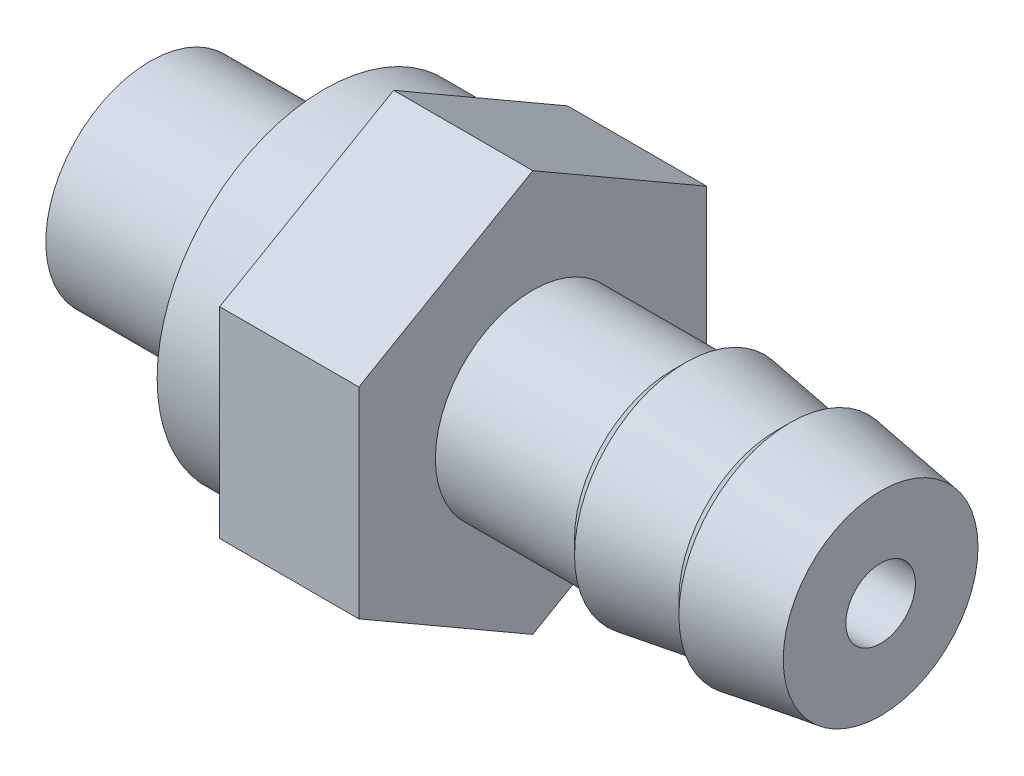
ISO-10303-21;
HEADER;
FILE_DESCRIPTION(('STEP AP214'),'2;1');
FILE_NAME('part.step','',(''),(''),'','','');
FILE_SCHEMA(('AUTOMOTIVE_DESIGN { 1 0 10303 214 1 1 1 1 }'));
ENDSEC;
DATA;
#1=APPLICATION_CONTEXT('core data for automotive mechanical design processes');
#2=APPLICATION_PROTOCOL_DEFINITION('international standard','automotive_design',2000,#1);
#3=PRODUCT_CONTEXT('',#1,'mechanical');
#4=PRODUCT('Part','Part','',(#3));
#5=PRODUCT_RELATED_PRODUCT_CATEGORY('part','',(#4));
#6=PRODUCT_DEFINITION_FORMATION('','',#4);
#7=PRODUCT_DEFINITION_CONTEXT('part definition',#1,'design');
#8=PRODUCT_DEFINITION('design','',#6,#7);
#9=PRODUCT_DEFINITION_SHAPE('','',#8);
#10=(LENGTH_UNIT() NAMED_UNIT(*) SI_UNIT(.MILLI.,.METRE.));
#11=(NAMED_UNIT(*) PLANE_ANGLE_UNIT() SI_UNIT($,.RADIAN.));
#12=(NAMED_UNIT(*) SI_UNIT($,.STERADIAN.) SOLID_ANGLE_UNIT());
#13=UNCERTAINTY_MEASURE_WITH_UNIT(LENGTH_MEASURE(1.E-05),#10,'distance_accuracy_value','');
#14=(GEOMETRIC_REPRESENTATION_CONTEXT(3) GLOBAL_UNCERTAINTY_ASSIGNED_CONTEXT((#13)) GLOBAL_UNIT_ASSIGNED_CONTEXT((#10,
#11,#12)) REPRESENTATION_CONTEXT('',''));
#15=CARTESIAN_POINT('',(0.,0.,0.));
#16=DIRECTION('',(0.,0.,1.));
#17=DIRECTION('',(1.,0.,0.));
#18=AXIS2_PLACEMENT_3D('',#15,#16,#17);
#19=CARTESIAN_POINT('',(5.50000000000003,2.88675134594087,0.));
#20=DIRECTION('',(-1.,0.,0.));
#21=DIRECTION('',(0.,-1.,0.));
#22=AXIS2_PLACEMENT_3D('',#19,#20,#21);
#23=PLANE('',#22);
#24=DIRECTION('',(0.,-0.500000000000001,-0.866025403784438));
#25=VECTOR('',#24,1.);
#26=CARTESIAN_POINT('',(5.50000000000003,-2.88675134594814,0.));
#27=LINE('',#26,#25);
#28=CARTESIAN_POINT('',(5.50000000000002,-2.88675134594814,0.));
#29=VERTEX_POINT('',#28);
#30=CARTESIAN_POINT('',(5.50000000000002,-1.44337567297407,2.49999999999999));
#31=VERTEX_POINT('',#30);
#32=EDGE_CURVE('E80',#29,#31,#27,.F.);
#33=ORIENTED_EDGE('',*,*,#32,.F.);
#34=DIRECTION('',(0.,0.499999999999999,-0.866025403784439));
#35=VECTOR('',#34,1.);
#36=CARTESIAN_POINT('',(5.49999999999999,-1.44337567297406,-2.50000000000002));
#37=LINE('',#36,#35);
#38=CARTESIAN_POINT('',(5.50000000000001,-1.44337567297406,-2.5));
#39=VERTEX_POINT('',#38);
#40=EDGE_CURVE('E71',#39,#29,#37,.F.);
#41=ORIENTED_EDGE('',*,*,#40,.F.);
#42=DIRECTION('',(0.,1.,0.));
#43=VECTOR('',#42,1.);
#44=CARTESIAN_POINT('',(5.49999999999999,1.44337567297406,-2.5));
#45=LINE('',#44,#43);
#46=CARTESIAN_POINT('',(5.50000000000002,1.44337567297406,-2.5));
#47=VERTEX_POINT('',#46);
#48=EDGE_CURVE('E66',#47,#39,#45,.F.);
#49=ORIENTED_EDGE('',*,*,#48,.F.);
#50=DIRECTION('',(0.,0.500000000000001,0.866025403784438));
#51=VECTOR('',#50,1.);
#52=CARTESIAN_POINT('',(5.50000000000003,2.88675134594814,0.));
#53=LINE('',#52,#51);
#54=CARTESIAN_POINT('',(5.50000000000003,2.88675134594905,1.5600529509057E-12));
#55=VERTEX_POINT('',#54);
#56=EDGE_CURVE('E140',#55,#47,#53,.F.);
#57=ORIENTED_EDGE('',*,*,#56,.F.);
#58=DIRECTION('',(0.,-0.499999999999999,0.866025403784439));
#59=VECTOR('',#58,1.);
#60=CARTESIAN_POINT('',(5.50000000000003,1.44337567297406,2.50000000000001));
#61=LINE('',#60,#59);
#62=CARTESIAN_POINT('',(5.50000000000002,1.44337567297589,2.49999999999999));
#63=VERTEX_POINT('',#62);
#64=EDGE_CURVE('E136',#63,#55,#61,.F.);
#65=ORIENTED_EDGE('',*,*,#64,.F.);
#66=DIRECTION('',(0.,-1.,0.));
#67=VECTOR('',#66,1.);
#68=CARTESIAN_POINT('',(5.5,-1.44337567297406,2.50000000000002));
#69=LINE('',#68,#67);
#70=EDGE_CURVE('E85',#31,#63,#69,.F.);
#71=ORIENTED_EDGE('',*,*,#70,.F.);
#72=EDGE_LOOP('',(#33,#41,#49,#57,#65,#71));
#73=FACE_BOUND('',#72,.T.);
#74=CARTESIAN_POINT('',(5.50000000000004,0.,0.));
#75=DIRECTION('',(-1.,0.,0.));
#76=DIRECTION('',(0.,-1.,0.));
#77=AXIS2_PLACEMENT_3D('',#74,#75,#76);
#78=CIRCLE('',#77,1.4);
#79=CARTESIAN_POINT('',(5.50000000000004,-1.4,0.));
#80=VERTEX_POINT('',#79);
#81=EDGE_CURVE('E19',#80,#80,#78,.F.);
#82=ORIENTED_EDGE('',*,*,#81,.F.);
#83=EDGE_LOOP('',(#82));
#84=FACE_BOUND('',#83,.T.);
#85=ADVANCED_FACE('F16',(#73,#84),#23,.F.);
#86=CARTESIAN_POINT('',(-4.74661546735969,-2.88675134594814,0.));
#87=DIRECTION('',(0.,-0.866025403784438,0.500000000000001));
#88=DIRECTION('',(0.,-0.500000000000001,-0.866025403784438));
#89=AXIS2_PLACEMENT_3D('',#86,#87,#88);
#90=PLANE('',#89);
#91=DIRECTION('',(1.,0.,0.));
#92=VECTOR('',#91,1.);
#93=CARTESIAN_POINT('',(-4.74661546735967,-1.44337567297406,2.50000000000002));
#94=LINE('',#93,#92);
#95=CARTESIAN_POINT('',(3.5,-1.44337567297408,2.49999999999999));
#96=VERTEX_POINT('',#95);
#97=EDGE_CURVE('E132',#96,#31,#94,.T.);
#98=ORIENTED_EDGE('',*,*,#97,.F.);
#99=DIRECTION('',(0.,-0.500000000000001,-0.866025403784438));
#100=VECTOR('',#99,1.);
#101=CARTESIAN_POINT('',(3.5,-1.44337567297406,2.50000000000001));
#102=LINE('',#101,#100);
#103=CARTESIAN_POINT('',(3.49999999999999,-2.88675134594814,0.));
#104=VERTEX_POINT('',#103);
#105=EDGE_CURVE('E92',#96,#104,#102,.T.);
#106=ORIENTED_EDGE('',*,*,#105,.T.);
#107=DIRECTION('',(1.,0.,0.));
#108=VECTOR('',#107,1.);
#109=CARTESIAN_POINT('',(-4.74661546735967,-2.88675134594813,0.));
#110=LINE('',#109,#108);
#111=EDGE_CURVE('E76',#29,#104,#110,.F.);
#112=ORIENTED_EDGE('',*,*,#111,.F.);
#113=ORIENTED_EDGE('',*,*,#32,.T.);
#114=EDGE_LOOP('',(#98,#106,#112,#113));
#115=FACE_BOUND('',#114,.T.);
#116=ADVANCED_FACE('F91',(#115),#90,.T.);
#117=CARTESIAN_POINT('',(-4.74661546735967,-1.44337567297406,-2.50000000000002));
#118=DIRECTION('',(0.,-0.866025403784439,-0.499999999999999));
#119=DIRECTION('',(0.,0.499999999999999,-0.866025403784439));
#120=AXIS2_PLACEMENT_3D('',#117,#118,#119);
#121=PLANE('',#120);
#122=ORIENTED_EDGE('',*,*,#111,.T.);
#123=DIRECTION('',(0.,0.500000000000003,-0.866025403784437));
#124=VECTOR('',#123,1.);
#125=CARTESIAN_POINT('',(3.5,-2.88675134594814,0.));
#126=LINE('',#125,#124);
#127=CARTESIAN_POINT('',(3.5,-1.44337567297406,-2.50000000000001));
#128=VERTEX_POINT('',#127);
#129=EDGE_CURVE('E150',#104,#128,#126,.T.);
#130=ORIENTED_EDGE('',*,*,#129,.T.);
#131=DIRECTION('',(1.,0.,0.));
#132=VECTOR('',#131,1.);
#133=CARTESIAN_POINT('',(-4.74661546735967,-1.44337567297406,-2.5));
#134=LINE('',#133,#132);
#135=EDGE_CURVE('E78',#39,#128,#134,.F.);
#136=ORIENTED_EDGE('',*,*,#135,.F.);
#137=ORIENTED_EDGE('',*,*,#40,.T.);
#138=EDGE_LOOP('',(#122,#130,#136,#137));
#139=FACE_BOUND('',#138,.T.);
#140=ADVANCED_FACE('F73',(#139),#121,.T.);
#141=CARTESIAN_POINT('',(-4.74661546735967,1.44337567297406,-2.5));
#142=DIRECTION('',(0.,0.,-1.));
#143=DIRECTION('',(0.,1.,0.));
#144=AXIS2_PLACEMENT_3D('',#141,#142,#143);
#145=PLANE('',#144);
#146=ORIENTED_EDGE('',*,*,#135,.T.);
#147=DIRECTION('',(0.,1.,0.));
#148=VECTOR('',#147,1.);
#149=CARTESIAN_POINT('',(3.5,2.39999999999418,-2.50000000000001));
#150=LINE('',#149,#148);
#151=CARTESIAN_POINT('',(3.5,1.44337567297406,-2.5));
#152=VERTEX_POINT('',#151);
#153=EDGE_CURVE('E144',#128,#152,#150,.T.);
#154=ORIENTED_EDGE('',*,*,#153,.T.);
#155=DIRECTION('',(1.,0.,0.));
#156=VECTOR('',#155,1.);
#157=CARTESIAN_POINT('',(-4.74661546735968,1.44337567297407,-2.50000000000001));
#158=LINE('',#157,#156);
#159=EDGE_CURVE('E138',#47,#152,#158,.F.);
#160=ORIENTED_EDGE('',*,*,#159,.F.);
#161=ORIENTED_EDGE('',*,*,#48,.T.);
#162=EDGE_LOOP('',(#146,#154,#160,#161));
#163=FACE_BOUND('',#162,.T.);
#164=ADVANCED_FACE('F143',(#163),#145,.T.);
#165=CARTESIAN_POINT('',(-4.74661546735968,2.88675134594814,0.));
#166=DIRECTION('',(0.,0.866025403784438,-0.500000000000001));
#167=DIRECTION('',(0.,0.500000000000001,0.866025403784438));
#168=AXIS2_PLACEMENT_3D('',#165,#166,#167);
#169=PLANE('',#168);
#170=ORIENTED_EDGE('',*,*,#159,.T.);
#171=DIRECTION('',(0.,0.499999999996226,0.866025403786617));
#172=VECTOR('',#171,1.);
#173=CARTESIAN_POINT('',(3.5,1.44337567297406,-2.5));
#174=LINE('',#173,#172);
#175=CARTESIAN_POINT('',(3.50000000000001,2.88675134594814,6.28327495437918E-12));
#176=VERTEX_POINT('',#175);
#177=EDGE_CURVE('E152',#152,#176,#174,.T.);
#178=ORIENTED_EDGE('',*,*,#177,.T.);
#179=DIRECTION('',(1.,0.,0.));
#180=VECTOR('',#179,1.);
#181=CARTESIAN_POINT('',(-4.74661546735967,2.88675134594814,0.));
#182=LINE('',#181,#180);
#183=EDGE_CURVE('E134',#55,#176,#182,.F.);
#184=ORIENTED_EDGE('',*,*,#183,.F.);
#185=ORIENTED_EDGE('',*,*,#56,.T.);
#186=EDGE_LOOP('',(#170,#178,#184,#185));
#187=FACE_BOUND('',#186,.T.);
#188=ADVANCED_FACE('F314',(#187),#169,.T.);
#189=CARTESIAN_POINT('',(-4.74661546735967,1.44337567297406,2.50000000000001));
#190=DIRECTION('',(0.,0.866025403784439,0.499999999999999));
#191=DIRECTION('',(0.,-0.499999999999999,0.866025403784439));
#192=AXIS2_PLACEMENT_3D('',#189,#190,#191);
#193=PLANE('',#192);
#194=ORIENTED_EDGE('',*,*,#183,.T.);
#195=DIRECTION('',(0.,-0.500000000000003,0.866025403784437));
#196=VECTOR('',#195,1.);
#197=CARTESIAN_POINT('',(3.5,2.88675134594087,1.25802146477838E-11));
#198=LINE('',#197,#196);
#199=CARTESIAN_POINT('',(3.50000000000001,1.44337567297588,2.5));
#200=VERTEX_POINT('',#199);
#201=EDGE_CURVE('E125',#176,#200,#198,.T.);
#202=ORIENTED_EDGE('',*,*,#201,.T.);
#203=DIRECTION('',(1.,0.,0.));
#204=VECTOR('',#203,1.);
#205=CARTESIAN_POINT('',(-4.74661546735967,1.44337567298133,2.50000000000002));
#206=LINE('',#205,#204);
#207=EDGE_CURVE('E34',#63,#200,#206,.F.);
#208=ORIENTED_EDGE('',*,*,#207,.F.);
#209=ORIENTED_EDGE('',*,*,#64,.T.);
#210=EDGE_LOOP('',(#194,#202,#208,#209));
#211=FACE_BOUND('',#210,.T.);
#212=ADVANCED_FACE('F306',(#211),#193,.T.);
#213=CARTESIAN_POINT('',(-4.74661546735967,-1.44337567297406,2.50000000000002));
#214=DIRECTION('',(0.,0.,1.));
#215=DIRECTION('',(0.,-1.,0.));
#216=AXIS2_PLACEMENT_3D('',#213,#214,#215);
#217=PLANE('',#216);
#218=ORIENTED_EDGE('',*,*,#207,.T.);
#219=DIRECTION('',(0.,1.,0.));
#220=VECTOR('',#219,1.);
#221=CARTESIAN_POINT('',(3.5,2.39999999999418,2.49999999999999));
#222=LINE('',#221,#220);
#223=EDGE_CURVE('E121',#200,#96,#222,.F.);
#224=ORIENTED_EDGE('',*,*,#223,.T.);
#225=ORIENTED_EDGE('',*,*,#97,.T.);
#226=ORIENTED_EDGE('',*,*,#70,.T.);
#227=EDGE_LOOP('',(#218,#224,#225,#226));
#228=FACE_BOUND('',#227,.T.);
#229=ADVANCED_FACE('F297',(#228),#217,.T.);
#230=CARTESIAN_POINT('',(0.,0.,0.));
#231=DIRECTION('',(-1.,0.,0.));
#232=DIRECTION('',(0.,-1.,0.));
#233=AXIS2_PLACEMENT_3D('',#230,#231,#232);
#234=CYLINDRICAL_SURFACE('',#233,1.4);
#235=ORIENTED_EDGE('',*,*,#81,.T.);
#236=EDGE_LOOP('',(#235));
#237=FACE_BOUND('',#236,.T.);
#238=CARTESIAN_POINT('',(7.49999999999318,0.,0.));
#239=DIRECTION('',(1.,0.,0.));
#240=DIRECTION('',(0.,0.,-1.));
#241=AXIS2_PLACEMENT_3D('',#238,#239,#240);
#242=CIRCLE('',#241,1.40000000004648);
#243=CARTESIAN_POINT('',(7.49999999999318,0.,-1.40000000004648));
#244=VERTEX_POINT('',#243);
#245=EDGE_CURVE('E115',#244,#244,#242,.T.);
#246=ORIENTED_EDGE('',*,*,#245,.F.);
#247=EDGE_LOOP('',(#246));
#248=FACE_BOUND('',#247,.T.);
#249=ADVANCED_FACE('F289',(#237,#248),#234,.T.);
#250=CARTESIAN_POINT('',(3.5,2.39999999999418,0.));
#251=DIRECTION('',(1.,0.,0.));
#252=DIRECTION('',(0.,1.,0.));
#253=AXIS2_PLACEMENT_3D('',#250,#251,#252);
#254=PLANE('',#253);
#255=ORIENTED_EDGE('',*,*,#201,.F.);
#256=ORIENTED_EDGE('',*,*,#177,.F.);
#257=ORIENTED_EDGE('',*,*,#153,.F.);
#258=ORIENTED_EDGE('',*,*,#129,.F.);
#259=ORIENTED_EDGE('',*,*,#105,.F.);
#260=ORIENTED_EDGE('',*,*,#223,.F.);
#261=EDGE_LOOP('',(#255,#256,#257,#258,#259,#260));
#262=FACE_BOUND('',#261,.T.);
#263=CARTESIAN_POINT('',(3.5,0.,0.));
#264=DIRECTION('',(-1.,0.,0.));
#265=DIRECTION('',(0.,-1.,0.));
#266=AXIS2_PLACEMENT_3D('',#263,#264,#265);
#267=CIRCLE('',#266,2.39999999999418);
#268=CARTESIAN_POINT('',(3.5,-2.39999999999418,0.));
#269=VERTEX_POINT('',#268);
#270=EDGE_CURVE('E113',#269,#269,#267,.T.);
#271=ORIENTED_EDGE('',*,*,#270,.F.);
#272=EDGE_LOOP('',(#271));
#273=FACE_BOUND('',#272,.T.);
#274=ADVANCED_FACE('F148',(#262,#273),#254,.F.);
#275=CARTESIAN_POINT('',(7.69999999994297,0.,0.));
#276=DIRECTION('',(1.,0.,0.));
#277=DIRECTION('',(0.,0.,-1.));
#278=AXIS2_PLACEMENT_3D('',#275,#276,#277);
#279=CONICAL_SURFACE('',#278,1.59999999999628,0.785398163397448);
#280=CARTESIAN_POINT('',(7.69999999999982,0.,0.));
#281=DIRECTION('',(-1.,0.,0.));
#282=DIRECTION('',(0.,0.,1.));
#283=AXIS2_PLACEMENT_3D('',#280,#281,#282);
#284=CIRCLE('',#283,1.6000000000105);
#285=CARTESIAN_POINT('',(7.69999999999982,0.,1.60000000001048));
#286=VERTEX_POINT('',#285);
#287=EDGE_CURVE('E112',#286,#286,#284,.F.);
#288=ORIENTED_EDGE('',*,*,#287,.F.);
#289=EDGE_LOOP('',(#288));
#290=FACE_BOUND('',#289,.T.);
#291=ORIENTED_EDGE('',*,*,#245,.T.);
#292=EDGE_LOOP('',(#291));
#293=FACE_BOUND('',#292,.T.);
#294=ADVANCED_FACE('F186',(#290,#293),#279,.T.);
#295=CARTESIAN_POINT('',(0.,0.,0.));
#296=DIRECTION('',(-1.,0.,0.));
#297=DIRECTION('',(0.,-1.,0.));
#298=AXIS2_PLACEMENT_3D('',#295,#296,#297);
#299=CYLINDRICAL_SURFACE('',#298,2.39999999999418);
#300=CARTESIAN_POINT('',(2.5,0.,0.));
#301=DIRECTION('',(-1.,0.,0.));
#302=DIRECTION('',(0.,-1.,0.));
#303=AXIS2_PLACEMENT_3D('',#300,#301,#302);
#304=CIRCLE('',#303,2.39999999999418);
#305=CARTESIAN_POINT('',(2.5,-2.39999999999418,0.));
#306=VERTEX_POINT('',#305);
#307=EDGE_CURVE('E110',#306,#306,#304,.F.);
#308=ORIENTED_EDGE('',*,*,#307,.T.);
#309=EDGE_LOOP('',(#308));
#310=FACE_BOUND('',#309,.T.);
#311=ORIENTED_EDGE('',*,*,#270,.T.);
#312=EDGE_LOOP('',(#311));
#313=FACE_BOUND('',#312,.T.);
#314=ADVANCED_FACE('F176',(#310,#313),#299,.T.);
#315=CARTESIAN_POINT('',(7.69999999994297,0.,0.));
#316=DIRECTION('',(-1.,0.,0.));
#317=DIRECTION('',(0.,0.,1.));
#318=AXIS2_PLACEMENT_3D('',#315,#316,#317);
#319=CONICAL_SURFACE('',#318,1.6000000000105,0.152649328394444);
#320=ORIENTED_EDGE('',*,*,#287,.T.);
#321=EDGE_LOOP('',(#320));
#322=FACE_BOUND('',#321,.T.);
#323=CARTESIAN_POINT('',(9.0000000000714,0.,0.));
#324=DIRECTION('',(1.,0.,0.));
#325=DIRECTION('',(0.,0.,-1.));
#326=AXIS2_PLACEMENT_3D('',#323,#324,#325);
#327=CIRCLE('',#326,1.39999999993279);
#328=CARTESIAN_POINT('',(9.0000000000714,0.,-1.39999999993279));
#329=VERTEX_POINT('',#328);
#330=EDGE_CURVE('E109',#329,#329,#327,.T.);
#331=ORIENTED_EDGE('',*,*,#330,.F.);
#332=EDGE_LOOP('',(#331));
#333=FACE_BOUND('',#332,.T.);
#334=ADVANCED_FACE('F174',(#322,#333),#319,.T.);
#335=CARTESIAN_POINT('',(2.50000000000003,1.5,0.));
#336=DIRECTION('',(1.,0.,0.));
#337=DIRECTION('',(0.,1.,0.));
#338=AXIS2_PLACEMENT_3D('',#335,#336,#337);
#339=PLANE('',#338);
#340=ORIENTED_EDGE('',*,*,#307,.F.);
#341=EDGE_LOOP('',(#340));
#342=FACE_BOUND('',#341,.T.);
#343=CARTESIAN_POINT('',(2.5,0.,0.));
#344=DIRECTION('',(-1.,0.,0.));
#345=DIRECTION('',(0.,-1.,0.));
#346=AXIS2_PLACEMENT_3D('',#343,#344,#345);
#347=CIRCLE('',#346,1.5);
#348=CARTESIAN_POINT('',(2.5,-1.5,0.));
#349=VERTEX_POINT('',#348);
#350=EDGE_CURVE('E106',#349,#349,#347,.T.);
#351=ORIENTED_EDGE('',*,*,#350,.F.);
#352=EDGE_LOOP('',(#351));
#353=FACE_BOUND('',#352,.T.);
#354=ADVANCED_FACE('F170',(#342,#353),#339,.F.);
#355=CARTESIAN_POINT('',(9.20000000002119,0.,0.));
#356=DIRECTION('',(1.,0.,0.));
#357=DIRECTION('',(0.,0.,-1.));
#358=AXIS2_PLACEMENT_3D('',#355,#356,#357);
#359=CONICAL_SURFACE('',#358,1.59999999988258,0.785398163397448);
#360=CARTESIAN_POINT('',(9.20000000002119,0.,0.));
#361=DIRECTION('',(-1.,0.,0.));
#362=DIRECTION('',(0.,0.,1.));
#363=AXIS2_PLACEMENT_3D('',#360,#361,#362);
#364=CIRCLE('',#363,1.59999999999626);
#365=CARTESIAN_POINT('',(9.20000000002119,0.,1.59999999999627));
#366=VERTEX_POINT('',#365);
#367=EDGE_CURVE('E105',#366,#366,#364,.F.);
#368=ORIENTED_EDGE('',*,*,#367,.F.);
#369=EDGE_LOOP('',(#368));
#370=FACE_BOUND('',#369,.T.);
#371=ORIENTED_EDGE('',*,*,#330,.T.);
#372=EDGE_LOOP('',(#371));
#373=FACE_BOUND('',#372,.T.);
#374=ADVANCED_FACE('F166',(#370,#373),#359,.T.);
#375=CARTESIAN_POINT('',(0.,0.,0.));
#376=DIRECTION('',(-1.,0.,0.));
#377=DIRECTION('',(0.,-1.,0.));
#378=AXIS2_PLACEMENT_3D('',#375,#376,#377);
#379=CYLINDRICAL_SURFACE('',#378,1.5);
#380=CARTESIAN_POINT('',(0.,0.,0.));
#381=DIRECTION('',(-1.,0.,0.));
#382=DIRECTION('',(0.,-1.,0.));
#383=AXIS2_PLACEMENT_3D('',#380,#381,#382);
#384=CIRCLE('',#383,1.5);
#385=CARTESIAN_POINT('',(0.,-1.5,0.));
#386=VERTEX_POINT('',#385);
#387=EDGE_CURVE('E102',#386,#386,#384,.F.);
#388=ORIENTED_EDGE('',*,*,#387,.T.);
#389=EDGE_LOOP('',(#388));
#390=FACE_BOUND('',#389,.T.);
#391=ORIENTED_EDGE('',*,*,#350,.T.);
#392=EDGE_LOOP('',(#391));
#393=FACE_BOUND('',#392,.T.);
#394=ADVANCED_FACE('F169',(#390,#393),#379,.T.);
#395=CARTESIAN_POINT('',(9.19999999996435,0.,0.));
#396=DIRECTION('',(-1.,0.,0.));
#397=DIRECTION('',(0.,0.,1.));
#398=AXIS2_PLACEMENT_3D('',#395,#396,#397);
#399=CONICAL_SURFACE('',#398,1.60000000001048,0.152649328394444);
#400=ORIENTED_EDGE('',*,*,#367,.T.);
#401=EDGE_LOOP('',(#400));
#402=FACE_BOUND('',#401,.T.);
#403=CARTESIAN_POINT('',(10.4999999999791,0.,0.));
#404=DIRECTION('',(-1.,0.,0.));
#405=DIRECTION('',(0.,0.,1.));
#406=AXIS2_PLACEMENT_3D('',#403,#404,#405);
#407=CIRCLE('',#406,1.4000000000093);
#408=CARTESIAN_POINT('',(10.4999999999791,0.,1.40000000000931));
#409=VERTEX_POINT('',#408);
#410=EDGE_CURVE('E99',#409,#409,#407,.T.);
#411=ORIENTED_EDGE('',*,*,#410,.T.);
#412=EDGE_LOOP('',(#411));
#413=FACE_BOUND('',#412,.T.);
#414=ADVANCED_FACE('F163',(#402,#413),#399,.T.);
#415=CARTESIAN_POINT('',(0.,0.5,0.));
#416=DIRECTION('',(1.,0.,0.));
#417=DIRECTION('',(0.,1.,0.));
#418=AXIS2_PLACEMENT_3D('',#415,#416,#417);
#419=PLANE('',#418);
#420=ORIENTED_EDGE('',*,*,#387,.F.);
#421=EDGE_LOOP('',(#420));
#422=FACE_BOUND('',#421,.T.);
#423=CARTESIAN_POINT('',(0.,0.,0.));
#424=DIRECTION('',(-1.,0.,0.));
#425=DIRECTION('',(0.,-1.,0.));
#426=AXIS2_PLACEMENT_3D('',#423,#424,#425);
#427=CIRCLE('',#426,0.500000000000001);
#428=CARTESIAN_POINT('',(0.,-0.500000000000001,0.));
#429=VERTEX_POINT('',#428);
#430=EDGE_CURVE('E25',#429,#429,#427,.F.);
#431=ORIENTED_EDGE('',*,*,#430,.T.);
#432=EDGE_LOOP('',(#431));
#433=FACE_BOUND('',#432,.T.);
#434=ADVANCED_FACE('F197',(#422,#433),#419,.F.);
#435=CARTESIAN_POINT('',(10.5,1.4,0.));
#436=DIRECTION('',(-1.,0.,0.));
#437=DIRECTION('',(0.,-1.,0.));
#438=AXIS2_PLACEMENT_3D('',#435,#436,#437);
#439=PLANE('',#438);
#440=CARTESIAN_POINT('',(10.5,0.,0.));
#441=DIRECTION('',(-1.,0.,0.));
#442=DIRECTION('',(0.,-1.,0.));
#443=AXIS2_PLACEMENT_3D('',#440,#441,#442);
#444=CIRCLE('',#443,0.500000000000001);
#445=CARTESIAN_POINT('',(10.5,-0.500000000000001,0.));
#446=VERTEX_POINT('',#445);
#447=EDGE_CURVE('E11',#446,#446,#444,.T.);
#448=ORIENTED_EDGE('',*,*,#447,.T.);
#449=EDGE_LOOP('',(#448));
#450=FACE_BOUND('',#449,.T.);
#451=ORIENTED_EDGE('',*,*,#410,.F.);
#452=EDGE_LOOP('',(#451));
#453=FACE_BOUND('',#452,.T.);
#454=ADVANCED_FACE('F191',(#450,#453),#439,.F.);
#455=CARTESIAN_POINT('',(0.,0.,0.));
#456=DIRECTION('',(-1.,0.,0.));
#457=DIRECTION('',(0.,-1.,0.));
#458=AXIS2_PLACEMENT_3D('',#455,#456,#457);
#459=CYLINDRICAL_SURFACE('',#458,0.500000000000001);
#460=ORIENTED_EDGE('',*,*,#430,.F.);
#461=EDGE_LOOP('',(#460));
#462=FACE_BOUND('',#461,.T.);
#463=ORIENTED_EDGE('',*,*,#447,.F.);
#464=EDGE_LOOP('',(#463));
#465=FACE_BOUND('',#464,.T.);
#466=ADVANCED_FACE('F189',(#462,#465),#459,.F.);
#467=CLOSED_SHELL('',(#85,#116,#140,#164,#188,#212,#229,#249,#274,#294,#314,#334,#354,#374,#394,
#414,#434,#454,#466));
#468=MANIFOLD_SOLID_BREP('B1',#467);
#469=ADVANCED_BREP_SHAPE_REPRESENTATION('',(#18,#468),#14);
#470=SHAPE_DEFINITION_REPRESENTATION(#9,#469);
ENDSEC;
END-ISO-10303-21;
